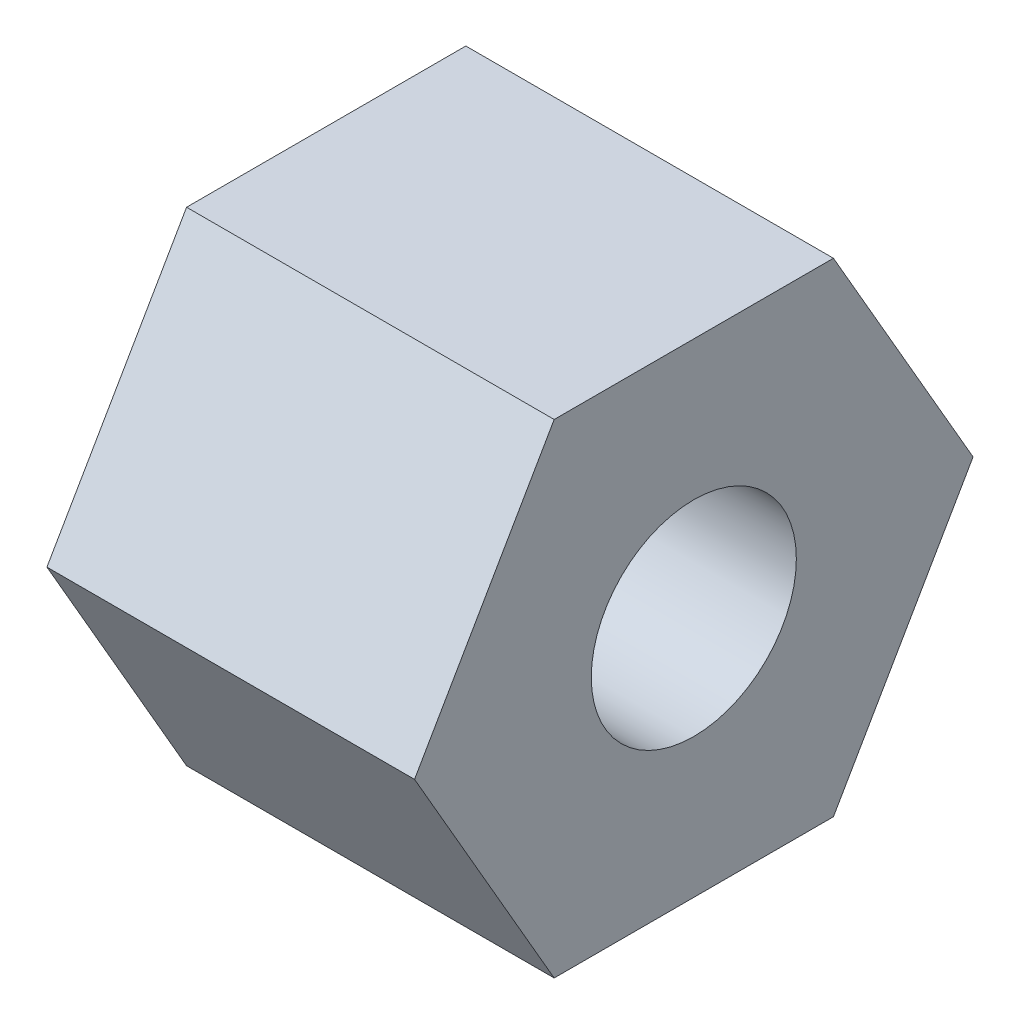
ISO-10303-21;
HEADER;
FILE_DESCRIPTION(('STEP AP214'),'2;1');
FILE_NAME('part.step','',(''),(''),'','','');
FILE_SCHEMA(('AUTOMOTIVE_DESIGN { 1 0 10303 214 1 1 1 1 }'));
ENDSEC;
DATA;
#1=APPLICATION_CONTEXT('core data for automotive mechanical design processes');
#2=APPLICATION_PROTOCOL_DEFINITION('international standard','automotive_design',2000,#1);
#3=PRODUCT_CONTEXT('',#1,'mechanical');
#4=PRODUCT('Part','Part','',(#3));
#5=PRODUCT_RELATED_PRODUCT_CATEGORY('part','',(#4));
#6=PRODUCT_DEFINITION_FORMATION('','',#4);
#7=PRODUCT_DEFINITION_CONTEXT('part definition',#1,'design');
#8=PRODUCT_DEFINITION('design','',#6,#7);
#9=PRODUCT_DEFINITION_SHAPE('','',#8);
#10=(LENGTH_UNIT() NAMED_UNIT(*) SI_UNIT(.MILLI.,.METRE.));
#11=(NAMED_UNIT(*) PLANE_ANGLE_UNIT() SI_UNIT($,.RADIAN.));
#12=(NAMED_UNIT(*) SI_UNIT($,.STERADIAN.) SOLID_ANGLE_UNIT());
#13=UNCERTAINTY_MEASURE_WITH_UNIT(LENGTH_MEASURE(1.E-05),#10,'distance_accuracy_value','');
#14=(GEOMETRIC_REPRESENTATION_CONTEXT(3) GLOBAL_UNCERTAINTY_ASSIGNED_CONTEXT((#13)) GLOBAL_UNIT_ASSIGNED_CONTEXT((#10,
#11,#12)) REPRESENTATION_CONTEXT('',''));
#15=CARTESIAN_POINT('',(0.,0.,0.));
#16=DIRECTION('',(0.,0.,1.));
#17=DIRECTION('',(1.,0.,0.));
#18=AXIS2_PLACEMENT_3D('',#15,#16,#17);
#19=CARTESIAN_POINT('',(38.1,0.,0.));
#20=DIRECTION('',(1.,0.,0.));
#21=DIRECTION('',(0.,1.,0.));
#22=AXIS2_PLACEMENT_3D('',#19,#20,#21);
#23=PLANE('',#22);
#24=CARTESIAN_POINT('',(38.1,0.,0.));
#25=DIRECTION('',(1.,0.,0.));
#26=DIRECTION('',(0.,0.,-1.));
#27=AXIS2_PLACEMENT_3D('',#24,#25,#26);
#28=CIRCLE('',#27,2.0193);
#29=CARTESIAN_POINT('',(38.1,0.,-2.0193));
#30=VERTEX_POINT('',#29);
#31=EDGE_CURVE('E129',#30,#30,#28,.T.);
#32=ORIENTED_EDGE('',*,*,#31,.F.);
#33=EDGE_LOOP('',(#32));
#34=FACE_BOUND('',#33,.T.);
#35=DIRECTION('',(0.,0.866025403784442,-0.5));
#36=VECTOR('',#35,1.);
#37=CARTESIAN_POINT('',(38.1,-4.7625,-2.74963065701564));
#38=LINE('',#37,#36);
#39=CARTESIAN_POINT('',(38.1,-4.7625,-2.74963065701564));
#40=VERTEX_POINT('',#39);
#41=CARTESIAN_POINT('',(38.1,0.,-5.49926131403117));
#42=VERTEX_POINT('',#41);
#43=EDGE_CURVE('E154',#40,#42,#38,.T.);
#44=ORIENTED_EDGE('',*,*,#43,.T.);
#45=DIRECTION('',(0.,0.866025403784438,0.5));
#46=VECTOR('',#45,1.);
#47=CARTESIAN_POINT('',(38.1,0.,-5.49926131403117));
#48=LINE('',#47,#46);
#49=CARTESIAN_POINT('',(38.1,4.7625,-2.74963065701557));
#50=VERTEX_POINT('',#49);
#51=EDGE_CURVE('E102',#42,#50,#48,.T.);
#52=ORIENTED_EDGE('',*,*,#51,.T.);
#53=DIRECTION('',(0.,0.,1.));
#54=VECTOR('',#53,1.);
#55=CARTESIAN_POINT('',(38.1,4.7625,-2.74963065701557));
#56=LINE('',#55,#54);
#57=CARTESIAN_POINT('',(38.1,4.7625,2.7496306570156));
#58=VERTEX_POINT('',#57);
#59=EDGE_CURVE('E143',#50,#58,#56,.T.);
#60=ORIENTED_EDGE('',*,*,#59,.T.);
#61=DIRECTION('',(0.,-0.866025403784442,0.5));
#62=VECTOR('',#61,1.);
#63=CARTESIAN_POINT('',(38.1,4.7625,2.7496306570156));
#64=LINE('',#63,#62);
#65=CARTESIAN_POINT('',(38.1,0.,5.49926131403117));
#66=VERTEX_POINT('',#65);
#67=EDGE_CURVE('E142',#58,#66,#64,.T.);
#68=ORIENTED_EDGE('',*,*,#67,.T.);
#69=DIRECTION('',(0.,-0.866025403784435,-0.500000000000007));
#70=VECTOR('',#69,1.);
#71=CARTESIAN_POINT('',(38.1,0.,5.49926131403117));
#72=LINE('',#71,#70);
#73=CARTESIAN_POINT('',(38.1,-4.7625,2.74963065701554));
#74=VERTEX_POINT('',#73);
#75=EDGE_CURVE('E55',#66,#74,#72,.T.);
#76=ORIENTED_EDGE('',*,*,#75,.T.);
#77=DIRECTION('',(0.,0.,-1.));
#78=VECTOR('',#77,1.);
#79=CARTESIAN_POINT('',(38.1,-4.7625,2.74963065701554));
#80=LINE('',#79,#78);
#81=EDGE_CURVE('E11',#74,#40,#80,.T.);
#82=ORIENTED_EDGE('',*,*,#81,.T.);
#83=EDGE_LOOP('',(#44,#52,#60,#68,#76,#82));
#84=FACE_BOUND('',#83,.T.);
#85=ADVANCED_FACE('F45',(#34,#84),#23,.T.);
#86=CARTESIAN_POINT('',(38.1,-4.7625,2.74963065701554));
#87=DIRECTION('',(0.,1.,0.));
#88=DIRECTION('',(0.,0.,-1.));
#89=AXIS2_PLACEMENT_3D('',#86,#87,#88);
#90=PLANE('',#89);
#91=DIRECTION('',(-1.,0.,0.));
#92=VECTOR('',#91,1.);
#93=CARTESIAN_POINT('',(38.1,-4.7625,2.74963065701554));
#94=LINE('',#93,#92);
#95=CARTESIAN_POINT('',(30.861,-4.7625,2.74963065701555));
#96=VERTEX_POINT('',#95);
#97=EDGE_CURVE('E148',#74,#96,#94,.T.);
#98=ORIENTED_EDGE('',*,*,#97,.T.);
#99=DIRECTION('',(0.,0.,-1.));
#100=VECTOR('',#99,1.);
#101=CARTESIAN_POINT('',(30.861,-4.7625,2.74963065701554));
#102=LINE('',#101,#100);
#103=CARTESIAN_POINT('',(30.861,-4.7625,-2.74963065701564));
#104=VERTEX_POINT('',#103);
#105=EDGE_CURVE('E124',#96,#104,#102,.T.);
#106=ORIENTED_EDGE('',*,*,#105,.T.);
#107=DIRECTION('',(-1.,0.,0.));
#108=VECTOR('',#107,1.);
#109=CARTESIAN_POINT('',(38.1,-4.7625,-2.74963065701564));
#110=LINE('',#109,#108);
#111=EDGE_CURVE('E157',#40,#104,#110,.T.);
#112=ORIENTED_EDGE('',*,*,#111,.F.);
#113=ORIENTED_EDGE('',*,*,#81,.F.);
#114=EDGE_LOOP('',(#98,#106,#112,#113));
#115=FACE_BOUND('',#114,.T.);
#116=ADVANCED_FACE('F178',(#115),#90,.F.);
#117=CARTESIAN_POINT('',(38.1,0.,5.49926131403117));
#118=DIRECTION('',(0.,0.500000000000007,-0.866025403784435));
#119=DIRECTION('',(-1.,0.,0.));
#120=AXIS2_PLACEMENT_3D('',#117,#118,#119);
#121=PLANE('',#120);
#122=DIRECTION('',(-1.,0.,0.));
#123=VECTOR('',#122,1.);
#124=CARTESIAN_POINT('',(38.1,0.,5.49926131403117));
#125=LINE('',#124,#123);
#126=CARTESIAN_POINT('',(30.861,0.,5.49926131403121));
#127=VERTEX_POINT('',#126);
#128=EDGE_CURVE('E135',#66,#127,#125,.T.);
#129=ORIENTED_EDGE('',*,*,#128,.T.);
#130=DIRECTION('',(0.,-0.866025403784435,-0.500000000000007));
#131=VECTOR('',#130,1.);
#132=CARTESIAN_POINT('',(30.861,0.,5.49926131403117));
#133=LINE('',#132,#131);
#134=EDGE_CURVE('E118',#127,#96,#133,.T.);
#135=ORIENTED_EDGE('',*,*,#134,.T.);
#136=ORIENTED_EDGE('',*,*,#97,.F.);
#137=ORIENTED_EDGE('',*,*,#75,.F.);
#138=EDGE_LOOP('',(#129,#135,#136,#137));
#139=FACE_BOUND('',#138,.T.);
#140=ADVANCED_FACE('F47',(#139),#121,.F.);
#141=CARTESIAN_POINT('',(38.1,4.7625,2.7496306570156));
#142=DIRECTION('',(0.,-0.5,-0.866025403784442));
#143=DIRECTION('',(0.,-0.866025403784442,0.5));
#144=AXIS2_PLACEMENT_3D('',#141,#142,#143);
#145=PLANE('',#144);
#146=DIRECTION('',(-1.,0.,0.));
#147=VECTOR('',#146,1.);
#148=CARTESIAN_POINT('',(38.1,4.7625,2.7496306570156));
#149=LINE('',#148,#147);
#150=CARTESIAN_POINT('',(30.861,4.76249999999998,2.74963065701562));
#151=VERTEX_POINT('',#150);
#152=EDGE_CURVE('E137',#58,#151,#149,.T.);
#153=ORIENTED_EDGE('',*,*,#152,.T.);
#154=DIRECTION('',(0.,0.866025403784439,-0.499999999999998));
#155=VECTOR('',#154,1.);
#156=CARTESIAN_POINT('',(30.861,7.14374999999999,1.37481532850782));
#157=LINE('',#156,#155);
#158=EDGE_CURVE('E121',#127,#151,#157,.T.);
#159=ORIENTED_EDGE('',*,*,#158,.F.);
#160=ORIENTED_EDGE('',*,*,#128,.F.);
#161=ORIENTED_EDGE('',*,*,#67,.F.);
#162=EDGE_LOOP('',(#153,#159,#160,#161));
#163=FACE_BOUND('',#162,.T.);
#164=ADVANCED_FACE('F134',(#163),#145,.F.);
#165=CARTESIAN_POINT('',(38.1,4.7625,-2.74963065701557));
#166=DIRECTION('',(0.,-1.,0.));
#167=DIRECTION('',(0.,0.,-1.));
#168=AXIS2_PLACEMENT_3D('',#165,#166,#167);
#169=PLANE('',#168);
#170=DIRECTION('',(-1.,0.,0.));
#171=VECTOR('',#170,1.);
#172=CARTESIAN_POINT('',(38.1,4.7625,-2.74963065701557));
#173=LINE('',#172,#171);
#174=CARTESIAN_POINT('',(30.861,4.7625,-2.74963065701558));
#175=VERTEX_POINT('',#174);
#176=EDGE_CURVE('E173',#50,#175,#173,.T.);
#177=ORIENTED_EDGE('',*,*,#176,.T.);
#178=DIRECTION('',(0.,0.,1.));
#179=VECTOR('',#178,1.);
#180=CARTESIAN_POINT('',(30.861,4.7625,-2.74963065701557));
#181=LINE('',#180,#179);
#182=EDGE_CURVE('E182',#175,#151,#181,.T.);
#183=ORIENTED_EDGE('',*,*,#182,.T.);
#184=ORIENTED_EDGE('',*,*,#152,.F.);
#185=ORIENTED_EDGE('',*,*,#59,.F.);
#186=EDGE_LOOP('',(#177,#183,#184,#185));
#187=FACE_BOUND('',#186,.T.);
#188=ADVANCED_FACE('F228',(#187),#169,.F.);
#189=CARTESIAN_POINT('',(38.1,0.,-5.49926131403117));
#190=DIRECTION('',(0.,-0.5,0.866025403784438));
#191=DIRECTION('',(-1.,0.,0.));
#192=AXIS2_PLACEMENT_3D('',#189,#190,#191);
#193=PLANE('',#192);
#194=DIRECTION('',(-1.,0.,0.));
#195=VECTOR('',#194,1.);
#196=CARTESIAN_POINT('',(38.1,0.,-5.49926131403117));
#197=LINE('',#196,#195);
#198=CARTESIAN_POINT('',(30.861,0.,-5.49926131403117));
#199=VERTEX_POINT('',#198);
#200=EDGE_CURVE('E158',#42,#199,#197,.T.);
#201=ORIENTED_EDGE('',*,*,#200,.T.);
#202=DIRECTION('',(0.,0.866025403784438,0.5));
#203=VECTOR('',#202,1.);
#204=CARTESIAN_POINT('',(30.861,0.,-5.49926131403117));
#205=LINE('',#204,#203);
#206=EDGE_CURVE('E63',#199,#175,#205,.T.);
#207=ORIENTED_EDGE('',*,*,#206,.T.);
#208=ORIENTED_EDGE('',*,*,#176,.F.);
#209=ORIENTED_EDGE('',*,*,#51,.F.);
#210=EDGE_LOOP('',(#201,#207,#208,#209));
#211=FACE_BOUND('',#210,.T.);
#212=ADVANCED_FACE('F260',(#211),#193,.F.);
#213=CARTESIAN_POINT('',(38.1,-4.7625,-2.74963065701564));
#214=DIRECTION('',(0.,0.5,0.866025403784442));
#215=DIRECTION('',(1.,0.,0.));
#216=AXIS2_PLACEMENT_3D('',#213,#214,#215);
#217=PLANE('',#216);
#218=ORIENTED_EDGE('',*,*,#111,.T.);
#219=DIRECTION('',(0.,0.866025403784439,-0.499999999999999));
#220=VECTOR('',#219,1.);
#221=CARTESIAN_POINT('',(30.861,-4.7625,-2.74963065701564));
#222=LINE('',#221,#220);
#223=EDGE_CURVE('E186',#104,#199,#222,.T.);
#224=ORIENTED_EDGE('',*,*,#223,.T.);
#225=ORIENTED_EDGE('',*,*,#200,.F.);
#226=ORIENTED_EDGE('',*,*,#43,.F.);
#227=EDGE_LOOP('',(#218,#224,#225,#226));
#228=FACE_BOUND('',#227,.T.);
#229=ADVANCED_FACE('F185',(#228),#217,.F.);
#230=CARTESIAN_POINT('',(-38.1,0.,0.));
#231=DIRECTION('',(-1.,0.,0.));
#232=DIRECTION('',(0.,0.,1.));
#233=AXIS2_PLACEMENT_3D('',#230,#231,#232);
#234=CYLINDRICAL_SURFACE('',#233,2.0193);
#235=CARTESIAN_POINT('',(30.861,0.,0.));
#236=DIRECTION('',(1.,0.,0.));
#237=DIRECTION('',(0.,0.,-1.));
#238=AXIS2_PLACEMENT_3D('',#235,#236,#237);
#239=CIRCLE('',#238,2.0193);
#240=CARTESIAN_POINT('',(30.861,0.,-2.0193));
#241=VERTEX_POINT('',#240);
#242=EDGE_CURVE('E49',#241,#241,#239,.F.);
#243=ORIENTED_EDGE('',*,*,#242,.T.);
#244=EDGE_LOOP('',(#243));
#245=FACE_BOUND('',#244,.T.);
#246=ORIENTED_EDGE('',*,*,#31,.T.);
#247=EDGE_LOOP('',(#246));
#248=FACE_BOUND('',#247,.T.);
#249=ADVANCED_FACE('F244',(#245,#248),#234,.F.);
#250=CARTESIAN_POINT('',(30.861,1.19062500000001,-8.93629963530066));
#251=DIRECTION('',(1.,0.,0.));
#252=DIRECTION('',(0.,0.,-1.));
#253=AXIS2_PLACEMENT_3D('',#250,#251,#252);
#254=PLANE('',#253);
#255=ORIENTED_EDGE('',*,*,#242,.F.);
#256=EDGE_LOOP('',(#255));
#257=FACE_BOUND('',#256,.T.);
#258=ORIENTED_EDGE('',*,*,#158,.T.);
#259=ORIENTED_EDGE('',*,*,#182,.F.);
#260=ORIENTED_EDGE('',*,*,#206,.F.);
#261=ORIENTED_EDGE('',*,*,#223,.F.);
#262=ORIENTED_EDGE('',*,*,#105,.F.);
#263=ORIENTED_EDGE('',*,*,#134,.F.);
#264=EDGE_LOOP('',(#258,#259,#260,#261,#262,#263));
#265=FACE_BOUND('',#264,.T.);
#266=ADVANCED_FACE('F120',(#257,#265),#254,.F.);
#267=CLOSED_SHELL('',(#85,#116,#140,#164,#188,#212,#229,#249,#266));
#268=MANIFOLD_SOLID_BREP('B2',#267);
#269=ADVANCED_BREP_SHAPE_REPRESENTATION('',(#18,#268),#14);
#270=SHAPE_DEFINITION_REPRESENTATION(#9,#269);
ENDSEC;
END-ISO-10303-21;
